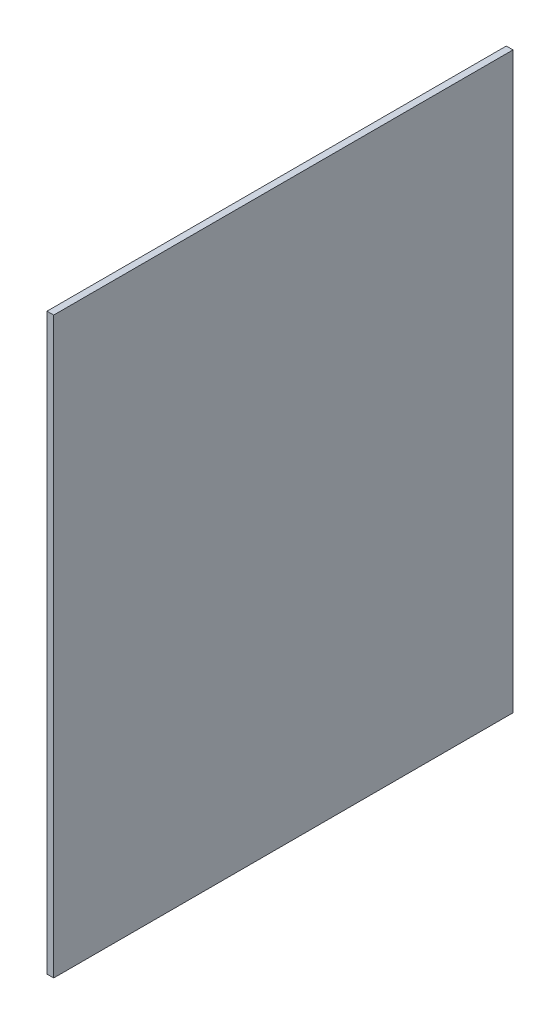
ISO-10303-21;
HEADER;
FILE_DESCRIPTION(('STEP AP214'),'2;1');
FILE_NAME('part.step','',(''),(''),'','','');
FILE_SCHEMA(('AUTOMOTIVE_DESIGN { 1 0 10303 214 1 1 1 1 }'));
ENDSEC;
DATA;
#1=APPLICATION_CONTEXT('core data for automotive mechanical design processes');
#2=APPLICATION_PROTOCOL_DEFINITION('international standard','automotive_design',2000,#1);
#3=PRODUCT_CONTEXT('',#1,'mechanical');
#4=PRODUCT('Part','Part','',(#3));
#5=PRODUCT_RELATED_PRODUCT_CATEGORY('part','',(#4));
#6=PRODUCT_DEFINITION_FORMATION('','',#4);
#7=PRODUCT_DEFINITION_CONTEXT('part definition',#1,'design');
#8=PRODUCT_DEFINITION('design','',#6,#7);
#9=PRODUCT_DEFINITION_SHAPE('','',#8);
#10=(LENGTH_UNIT() NAMED_UNIT(*) SI_UNIT(.MILLI.,.METRE.));
#11=(NAMED_UNIT(*) PLANE_ANGLE_UNIT() SI_UNIT($,.RADIAN.));
#12=(NAMED_UNIT(*) SI_UNIT($,.STERADIAN.) SOLID_ANGLE_UNIT());
#13=UNCERTAINTY_MEASURE_WITH_UNIT(LENGTH_MEASURE(1.E-05),#10,'distance_accuracy_value','');
#14=(GEOMETRIC_REPRESENTATION_CONTEXT(3) GLOBAL_UNCERTAINTY_ASSIGNED_CONTEXT((#13)) GLOBAL_UNIT_ASSIGNED_CONTEXT((#10,
#11,#12)) REPRESENTATION_CONTEXT('',''));
#15=CARTESIAN_POINT('',(0.,0.,0.));
#16=DIRECTION('',(0.,0.,1.));
#17=DIRECTION('',(1.,0.,0.));
#18=AXIS2_PLACEMENT_3D('',#15,#16,#17);
#19=CARTESIAN_POINT('',(2.9718,-5.54541910331385,0.));
#20=DIRECTION('',(0.,1.,0.));
#21=DIRECTION('',(0.,0.,1.));
#22=AXIS2_PLACEMENT_3D('',#19,#20,#21);
#23=PLANE('',#22);
#24=DIRECTION('',(0.,0.,-1.));
#25=VECTOR('',#24,1.);
#26=CARTESIAN_POINT('',(0.,-5.54541910331385,0.));
#27=LINE('',#26,#25);
#28=CARTESIAN_POINT('',(0.,-5.54541910331385,203.2));
#29=VERTEX_POINT('',#28);
#30=CARTESIAN_POINT('',(0.,-5.54541910331385,0.));
#31=VERTEX_POINT('',#30);
#32=EDGE_CURVE('E104',#29,#31,#27,.T.);
#33=ORIENTED_EDGE('',*,*,#32,.T.);
#34=DIRECTION('',(-1.,0.,0.));
#35=VECTOR('',#34,1.);
#36=CARTESIAN_POINT('',(2.9718,-5.54541910331385,0.));
#37=LINE('',#36,#35);
#38=CARTESIAN_POINT('',(2.9718,-5.54541910331385,0.));
#39=VERTEX_POINT('',#38);
#40=EDGE_CURVE('E11',#39,#31,#37,.T.);
#41=ORIENTED_EDGE('',*,*,#40,.F.);
#42=DIRECTION('',(0.,0.,-1.));
#43=VECTOR('',#42,1.);
#44=CARTESIAN_POINT('',(2.9718,-5.54541910331385,0.));
#45=LINE('',#44,#43);
#46=CARTESIAN_POINT('',(2.9718,-5.54541910331385,203.2));
#47=VERTEX_POINT('',#46);
#48=EDGE_CURVE('E92',#47,#39,#45,.T.);
#49=ORIENTED_EDGE('',*,*,#48,.F.);
#50=DIRECTION('',(-1.,0.,0.));
#51=VECTOR('',#50,1.);
#52=CARTESIAN_POINT('',(2.9718,-5.54541910331385,203.2));
#53=LINE('',#52,#51);
#54=EDGE_CURVE('E100',#47,#29,#53,.T.);
#55=ORIENTED_EDGE('',*,*,#54,.T.);
#56=EDGE_LOOP('',(#33,#41,#49,#55));
#57=FACE_BOUND('',#56,.T.);
#58=ADVANCED_FACE('F41',(#57),#23,.F.);
#59=CARTESIAN_POINT('',(2.9718,-5.54541910331385,0.));
#60=DIRECTION('',(0.,0.,1.));
#61=DIRECTION('',(1.,0.,0.));
#62=AXIS2_PLACEMENT_3D('',#59,#60,#61);
#63=PLANE('',#62);
#64=DIRECTION('',(0.,1.,0.));
#65=VECTOR('',#64,1.);
#66=CARTESIAN_POINT('',(0.,-5.54541910331385,0.));
#67=LINE('',#66,#65);
#68=CARTESIAN_POINT('',(0.,248.454580896686,0.));
#69=VERTEX_POINT('',#68);
#70=EDGE_CURVE('E96',#31,#69,#67,.T.);
#71=ORIENTED_EDGE('',*,*,#70,.T.);
#72=DIRECTION('',(-1.,0.,0.));
#73=VECTOR('',#72,1.);
#74=CARTESIAN_POINT('',(2.9718,248.454580896686,0.));
#75=LINE('',#74,#73);
#76=CARTESIAN_POINT('',(2.9718,248.454580896686,0.));
#77=VERTEX_POINT('',#76);
#78=EDGE_CURVE('E49',#77,#69,#75,.T.);
#79=ORIENTED_EDGE('',*,*,#78,.F.);
#80=DIRECTION('',(0.,1.,0.));
#81=VECTOR('',#80,1.);
#82=CARTESIAN_POINT('',(2.9718,-5.54541910331385,0.));
#83=LINE('',#82,#81);
#84=EDGE_CURVE('E87',#39,#77,#83,.T.);
#85=ORIENTED_EDGE('',*,*,#84,.F.);
#86=ORIENTED_EDGE('',*,*,#40,.T.);
#87=EDGE_LOOP('',(#71,#79,#85,#86));
#88=FACE_BOUND('',#87,.T.);
#89=ADVANCED_FACE('F95',(#88),#63,.F.);
#90=CARTESIAN_POINT('',(2.9718,248.454580896686,0.));
#91=DIRECTION('',(0.,-1.,0.));
#92=DIRECTION('',(0.,0.,-1.));
#93=AXIS2_PLACEMENT_3D('',#90,#91,#92);
#94=PLANE('',#93);
#95=DIRECTION('',(0.,0.,1.));
#96=VECTOR('',#95,1.);
#97=CARTESIAN_POINT('',(0.,248.454580896686,0.));
#98=LINE('',#97,#96);
#99=CARTESIAN_POINT('',(0.,248.454580896686,203.2));
#100=VERTEX_POINT('',#99);
#101=EDGE_CURVE('E74',#69,#100,#98,.T.);
#102=ORIENTED_EDGE('',*,*,#101,.T.);
#103=DIRECTION('',(-1.,0.,0.));
#104=VECTOR('',#103,1.);
#105=CARTESIAN_POINT('',(2.9718,248.454580896686,203.2));
#106=LINE('',#105,#104);
#107=CARTESIAN_POINT('',(2.9718,248.454580896686,203.2));
#108=VERTEX_POINT('',#107);
#109=EDGE_CURVE('E97',#108,#100,#106,.T.);
#110=ORIENTED_EDGE('',*,*,#109,.F.);
#111=DIRECTION('',(0.,0.,1.));
#112=VECTOR('',#111,1.);
#113=CARTESIAN_POINT('',(2.9718,248.454580896686,0.));
#114=LINE('',#113,#112);
#115=EDGE_CURVE('E90',#77,#108,#114,.T.);
#116=ORIENTED_EDGE('',*,*,#115,.F.);
#117=ORIENTED_EDGE('',*,*,#78,.T.);
#118=EDGE_LOOP('',(#102,#110,#116,#117));
#119=FACE_BOUND('',#118,.T.);
#120=ADVANCED_FACE('F98',(#119),#94,.F.);
#121=CARTESIAN_POINT('',(2.9718,-5.54541910331385,203.2));
#122=DIRECTION('',(0.,0.,-1.));
#123=DIRECTION('',(-1.,0.,0.));
#124=AXIS2_PLACEMENT_3D('',#121,#122,#123);
#125=PLANE('',#124);
#126=DIRECTION('',(0.,-1.,0.));
#127=VECTOR('',#126,1.);
#128=CARTESIAN_POINT('',(0.,-5.54541910331385,203.2));
#129=LINE('',#128,#127);
#130=EDGE_CURVE('E80',#100,#29,#129,.T.);
#131=ORIENTED_EDGE('',*,*,#130,.T.);
#132=ORIENTED_EDGE('',*,*,#54,.F.);
#133=DIRECTION('',(0.,-1.,0.));
#134=VECTOR('',#133,1.);
#135=CARTESIAN_POINT('',(2.9718,-5.54541910331385,203.2));
#136=LINE('',#135,#134);
#137=EDGE_CURVE('E57',#108,#47,#136,.T.);
#138=ORIENTED_EDGE('',*,*,#137,.F.);
#139=ORIENTED_EDGE('',*,*,#109,.T.);
#140=EDGE_LOOP('',(#131,#132,#138,#139));
#141=FACE_BOUND('',#140,.T.);
#142=ADVANCED_FACE('F111',(#141),#125,.F.);
#143=CARTESIAN_POINT('',(2.9718,0.,0.));
#144=DIRECTION('',(-1.,0.,0.));
#145=DIRECTION('',(0.,0.,1.));
#146=AXIS2_PLACEMENT_3D('',#143,#144,#145);
#147=PLANE('',#146);
#148=ORIENTED_EDGE('',*,*,#48,.T.);
#149=ORIENTED_EDGE('',*,*,#84,.T.);
#150=ORIENTED_EDGE('',*,*,#115,.T.);
#151=ORIENTED_EDGE('',*,*,#137,.T.);
#152=EDGE_LOOP('',(#148,#149,#150,#151));
#153=FACE_BOUND('',#152,.T.);
#154=ADVANCED_FACE('F88',(#153),#147,.F.);
#155=CARTESIAN_POINT('',(0.,0.,0.));
#156=DIRECTION('',(-1.,0.,0.));
#157=DIRECTION('',(0.,0.,1.));
#158=AXIS2_PLACEMENT_3D('',#155,#156,#157);
#159=PLANE('',#158);
#160=ORIENTED_EDGE('',*,*,#32,.F.);
#161=ORIENTED_EDGE('',*,*,#130,.F.);
#162=ORIENTED_EDGE('',*,*,#101,.F.);
#163=ORIENTED_EDGE('',*,*,#70,.F.);
#164=EDGE_LOOP('',(#160,#161,#162,#163));
#165=FACE_BOUND('',#164,.T.);
#166=ADVANCED_FACE('F114',(#165),#159,.T.);
#167=CLOSED_SHELL('',(#58,#89,#120,#142,#154,#166));
#168=MANIFOLD_SOLID_BREP('B2',#167);
#169=ADVANCED_BREP_SHAPE_REPRESENTATION('',(#18,#168),#14);
#170=SHAPE_DEFINITION_REPRESENTATION(#9,#169);
ENDSEC;
END-ISO-10303-21;
